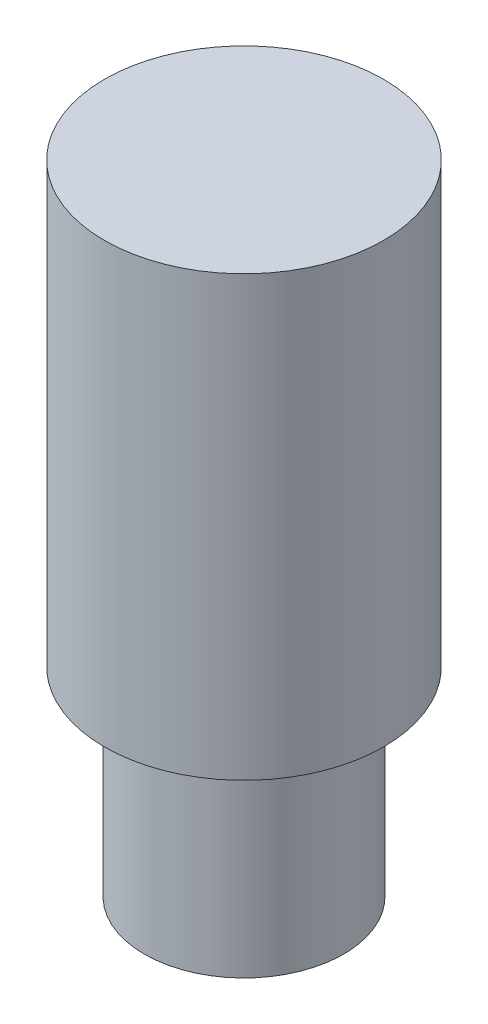
ISO-10303-21;
HEADER;
FILE_DESCRIPTION(('STEP AP214'),'2;1');
FILE_NAME('part.step','',(''),(''),'','','');
FILE_SCHEMA(('AUTOMOTIVE_DESIGN { 1 0 10303 214 1 1 1 1 }'));
ENDSEC;
DATA;
#1=APPLICATION_CONTEXT('core data for automotive mechanical design processes');
#2=APPLICATION_PROTOCOL_DEFINITION('international standard','automotive_design',2000,#1);
#3=PRODUCT_CONTEXT('',#1,'mechanical');
#4=PRODUCT('Part','Part','',(#3));
#5=PRODUCT_RELATED_PRODUCT_CATEGORY('part','',(#4));
#6=PRODUCT_DEFINITION_FORMATION('','',#4);
#7=PRODUCT_DEFINITION_CONTEXT('part definition',#1,'design');
#8=PRODUCT_DEFINITION('design','',#6,#7);
#9=PRODUCT_DEFINITION_SHAPE('','',#8);
#10=(LENGTH_UNIT() NAMED_UNIT(*) SI_UNIT(.MILLI.,.METRE.));
#11=(NAMED_UNIT(*) PLANE_ANGLE_UNIT() SI_UNIT($,.RADIAN.));
#12=(NAMED_UNIT(*) SI_UNIT($,.STERADIAN.) SOLID_ANGLE_UNIT());
#13=UNCERTAINTY_MEASURE_WITH_UNIT(LENGTH_MEASURE(1.E-05),#10,'distance_accuracy_value','');
#14=(GEOMETRIC_REPRESENTATION_CONTEXT(3) GLOBAL_UNCERTAINTY_ASSIGNED_CONTEXT((#13)) GLOBAL_UNIT_ASSIGNED_CONTEXT((#10,
#11,#12)) REPRESENTATION_CONTEXT('',''));
#15=CARTESIAN_POINT('',(0.,0.,0.));
#16=DIRECTION('',(0.,0.,1.));
#17=DIRECTION('',(1.,0.,0.));
#18=AXIS2_PLACEMENT_3D('',#15,#16,#17);
#19=CARTESIAN_POINT('',(0.,5.,0.));
#20=DIRECTION('',(0.,-1.,0.));
#21=DIRECTION('',(0.,0.,-1.));
#22=AXIS2_PLACEMENT_3D('',#19,#20,#21);
#23=CYLINDRICAL_SURFACE('',#22,2.5);
#24=CARTESIAN_POINT('',(0.,5.,0.));
#25=DIRECTION('',(0.,1.,0.));
#26=DIRECTION('',(0.,0.,1.));
#27=AXIS2_PLACEMENT_3D('',#24,#25,#26);
#28=CIRCLE('',#27,2.5);
#29=CARTESIAN_POINT('',(0.,5.,2.5));
#30=VERTEX_POINT('',#29);
#31=EDGE_CURVE('E10',#30,#30,#28,.T.);
#32=ORIENTED_EDGE('',*,*,#31,.F.);
#33=EDGE_LOOP('',(#32));
#34=FACE_BOUND('',#33,.T.);
#35=CARTESIAN_POINT('',(0.,0.,0.));
#36=DIRECTION('',(0.,1.,0.));
#37=DIRECTION('',(0.,0.,1.));
#38=AXIS2_PLACEMENT_3D('',#35,#36,#37);
#39=CIRCLE('',#38,2.5);
#40=CARTESIAN_POINT('',(0.,0.,2.5));
#41=VERTEX_POINT('',#40);
#42=EDGE_CURVE('E34',#41,#41,#39,.T.);
#43=ORIENTED_EDGE('',*,*,#42,.T.);
#44=EDGE_LOOP('',(#43));
#45=FACE_BOUND('',#44,.T.);
#46=ADVANCED_FACE('F31',(#34,#45),#23,.T.);
#47=CARTESIAN_POINT('',(0.,0.,0.));
#48=DIRECTION('',(0.,1.,0.));
#49=DIRECTION('',(0.,0.,1.));
#50=AXIS2_PLACEMENT_3D('',#47,#48,#49);
#51=PLANE('',#50);
#52=CARTESIAN_POINT('',(0.,0.,0.));
#53=DIRECTION('',(0.,-1.,0.));
#54=DIRECTION('',(0.,0.,-1.));
#55=AXIS2_PLACEMENT_3D('',#52,#53,#54);
#56=CIRCLE('',#55,2.2);
#57=CARTESIAN_POINT('',(0.,0.,-2.2));
#58=VERTEX_POINT('',#57);
#59=EDGE_CURVE('E48',#58,#58,#56,.T.);
#60=ORIENTED_EDGE('',*,*,#59,.F.);
#61=EDGE_LOOP('',(#60));
#62=FACE_BOUND('',#61,.T.);
#63=ORIENTED_EDGE('',*,*,#42,.F.);
#64=EDGE_LOOP('',(#63));
#65=FACE_BOUND('',#64,.T.);
#66=ADVANCED_FACE('F80',(#62,#65),#51,.F.);
#67=CARTESIAN_POINT('',(0.,4.975,0.));
#68=DIRECTION('',(0.,1.,0.));
#69=DIRECTION('',(0.,0.,1.));
#70=AXIS2_PLACEMENT_3D('',#67,#68,#69);
#71=CONICAL_SURFACE('',#70,1.2,0.785398163397457);
#72=CARTESIAN_POINT('',(0.,5.,0.));
#73=DIRECTION('',(0.,-1.,0.));
#74=DIRECTION('',(0.,0.,-1.));
#75=AXIS2_PLACEMENT_3D('',#72,#73,#74);
#76=CIRCLE('',#75,1.225);
#77=CARTESIAN_POINT('',(0.,5.,-1.225));
#78=VERTEX_POINT('',#77);
#79=EDGE_CURVE('E51',#78,#78,#76,.T.);
#80=ORIENTED_EDGE('',*,*,#79,.F.);
#81=EDGE_LOOP('',(#80));
#82=FACE_BOUND('',#81,.T.);
#83=CARTESIAN_POINT('',(0.,4.975,0.));
#84=DIRECTION('',(0.,-1.,0.));
#85=DIRECTION('',(0.,0.,-1.));
#86=AXIS2_PLACEMENT_3D('',#83,#84,#85);
#87=CIRCLE('',#86,1.2);
#88=CARTESIAN_POINT('',(0.,4.975,-1.2));
#89=VERTEX_POINT('',#88);
#90=EDGE_CURVE('E41',#89,#89,#87,.T.);
#91=ORIENTED_EDGE('',*,*,#90,.T.);
#92=EDGE_LOOP('',(#91));
#93=FACE_BOUND('',#92,.T.);
#94=ADVANCED_FACE('F85',(#82,#93),#71,.F.);
#95=CARTESIAN_POINT('',(0.,0.,0.));
#96=DIRECTION('',(0.,-1.,0.));
#97=DIRECTION('',(0.,0.,-1.));
#98=AXIS2_PLACEMENT_3D('',#95,#96,#97);
#99=CYLINDRICAL_SURFACE('',#98,1.2);
#100=ORIENTED_EDGE('',*,*,#90,.F.);
#101=EDGE_LOOP('',(#100));
#102=FACE_BOUND('',#101,.T.);
#103=CARTESIAN_POINT('',(0.,1.,0.));
#104=DIRECTION('',(0.,-1.,0.));
#105=DIRECTION('',(0.,0.,-1.));
#106=AXIS2_PLACEMENT_3D('',#103,#104,#105);
#107=CIRCLE('',#106,1.2);
#108=CARTESIAN_POINT('',(0.,1.,-1.2));
#109=VERTEX_POINT('',#108);
#110=EDGE_CURVE('E45',#109,#109,#107,.T.);
#111=ORIENTED_EDGE('',*,*,#110,.T.);
#112=EDGE_LOOP('',(#111));
#113=FACE_BOUND('',#112,.T.);
#114=ADVANCED_FACE('F93',(#102,#113),#99,.F.);
#115=CARTESIAN_POINT('',(0.,0.,0.));
#116=DIRECTION('',(0.,-1.,0.));
#117=DIRECTION('',(0.,0.,-1.));
#118=AXIS2_PLACEMENT_3D('',#115,#116,#117);
#119=CONICAL_SURFACE('',#118,2.2,0.785398163397448);
#120=ORIENTED_EDGE('',*,*,#110,.F.);
#121=EDGE_LOOP('',(#120));
#122=FACE_BOUND('',#121,.T.);
#123=ORIENTED_EDGE('',*,*,#59,.T.);
#124=EDGE_LOOP('',(#123));
#125=FACE_BOUND('',#124,.T.);
#126=ADVANCED_FACE('F76',(#122,#125),#119,.F.);
#127=CARTESIAN_POINT('',(0.,5.,0.));
#128=DIRECTION('',(0.,1.,0.));
#129=DIRECTION('',(0.,0.,1.));
#130=AXIS2_PLACEMENT_3D('',#127,#128,#129);
#131=PLANE('',#130);
#132=ORIENTED_EDGE('',*,*,#79,.T.);
#133=EDGE_LOOP('',(#132));
#134=FACE_BOUND('',#133,.T.);
#135=ADVANCED_FACE('F71',(#134),#131,.F.);
#136=CARTESIAN_POINT('',(0.,5.,0.));
#137=DIRECTION('',(0.,1.,0.));
#138=DIRECTION('',(0.,0.,1.));
#139=AXIS2_PLACEMENT_3D('',#136,#137,#138);
#140=CIRCLE('',#139,3.5);
#141=CARTESIAN_POINT('',(0.,5.,3.5));
#142=VERTEX_POINT('',#141);
#143=EDGE_CURVE('E55',#142,#142,#140,.T.);
#144=ORIENTED_EDGE('',*,*,#143,.F.);
#145=EDGE_LOOP('',(#144));
#146=FACE_BOUND('',#145,.T.);
#147=ORIENTED_EDGE('',*,*,#31,.T.);
#148=EDGE_LOOP('',(#147));
#149=FACE_BOUND('',#148,.T.);
#150=ADVANCED_FACE('F66',(#146,#149),#131,.F.);
#151=CARTESIAN_POINT('',(0.,16.,0.));
#152=DIRECTION('',(0.,-1.,0.));
#153=DIRECTION('',(0.,0.,-1.));
#154=AXIS2_PLACEMENT_3D('',#151,#152,#153);
#155=CYLINDRICAL_SURFACE('',#154,3.5);
#156=CARTESIAN_POINT('',(0.,16.,0.));
#157=DIRECTION('',(0.,1.,0.));
#158=DIRECTION('',(0.,0.,1.));
#159=AXIS2_PLACEMENT_3D('',#156,#157,#158);
#160=CIRCLE('',#159,3.5);
#161=CARTESIAN_POINT('',(0.,16.,3.5));
#162=VERTEX_POINT('',#161);
#163=EDGE_CURVE('E54',#162,#162,#160,.T.);
#164=ORIENTED_EDGE('',*,*,#163,.F.);
#165=EDGE_LOOP('',(#164));
#166=FACE_BOUND('',#165,.T.);
#167=ORIENTED_EDGE('',*,*,#143,.T.);
#168=EDGE_LOOP('',(#167));
#169=FACE_BOUND('',#168,.T.);
#170=ADVANCED_FACE('F63',(#166,#169),#155,.T.);
#171=CARTESIAN_POINT('',(0.,16.,0.));
#172=DIRECTION('',(0.,1.,0.));
#173=DIRECTION('',(0.,0.,1.));
#174=AXIS2_PLACEMENT_3D('',#171,#172,#173);
#175=PLANE('',#174);
#176=ORIENTED_EDGE('',*,*,#163,.T.);
#177=EDGE_LOOP('',(#176));
#178=FACE_BOUND('',#177,.T.);
#179=ADVANCED_FACE('F61',(#178),#175,.T.);
#180=CLOSED_SHELL('',(#46,#66,#94,#114,#126,#135,#150,#170,#179));
#181=MANIFOLD_SOLID_BREP('B2',#180);
#182=ADVANCED_BREP_SHAPE_REPRESENTATION('',(#18,#181),#14);
#183=SHAPE_DEFINITION_REPRESENTATION(#9,#182);
ENDSEC;
END-ISO-10303-21;
